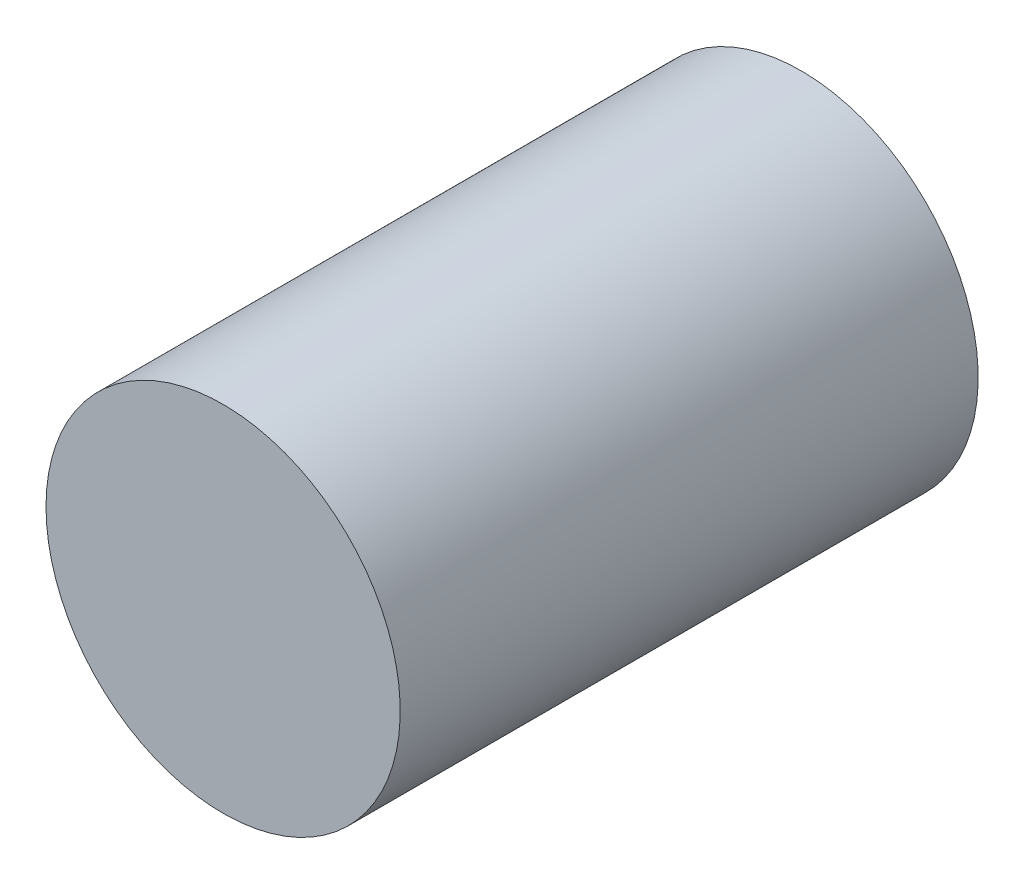
ISO-10303-21;
HEADER;
FILE_DESCRIPTION(('STEP AP214'),'2;1');
FILE_NAME('part.step','',(''),(''),'','','');
FILE_SCHEMA(('AUTOMOTIVE_DESIGN { 1 0 10303 214 1 1 1 1 }'));
ENDSEC;
DATA;
#1=APPLICATION_CONTEXT('core data for automotive mechanical design processes');
#2=APPLICATION_PROTOCOL_DEFINITION('international standard','automotive_design',2000,#1);
#3=PRODUCT_CONTEXT('',#1,'mechanical');
#4=PRODUCT('Part','Part','',(#3));
#5=PRODUCT_RELATED_PRODUCT_CATEGORY('part','',(#4));
#6=PRODUCT_DEFINITION_FORMATION('','',#4);
#7=PRODUCT_DEFINITION_CONTEXT('part definition',#1,'design');
#8=PRODUCT_DEFINITION('design','',#6,#7);
#9=PRODUCT_DEFINITION_SHAPE('','',#8);
#10=(LENGTH_UNIT() NAMED_UNIT(*) SI_UNIT(.MILLI.,.METRE.));
#11=(NAMED_UNIT(*) PLANE_ANGLE_UNIT() SI_UNIT($,.RADIAN.));
#12=(NAMED_UNIT(*) SI_UNIT($,.STERADIAN.) SOLID_ANGLE_UNIT());
#13=UNCERTAINTY_MEASURE_WITH_UNIT(LENGTH_MEASURE(1.E-05),#10,'distance_accuracy_value','');
#14=(GEOMETRIC_REPRESENTATION_CONTEXT(3) GLOBAL_UNCERTAINTY_ASSIGNED_CONTEXT((#13)) GLOBAL_UNIT_ASSIGNED_CONTEXT((#10,
#11,#12)) REPRESENTATION_CONTEXT('',''));
#15=CARTESIAN_POINT('',(0.,0.,0.));
#16=DIRECTION('',(0.,0.,1.));
#17=DIRECTION('',(1.,0.,0.));
#18=AXIS2_PLACEMENT_3D('',#15,#16,#17);
#19=CARTESIAN_POINT('',(0.,0.,186.));
#20=DIRECTION('',(0.,0.,-1.));
#21=DIRECTION('',(-1.,0.,0.));
#22=AXIS2_PLACEMENT_3D('',#19,#20,#21);
#23=CYLINDRICAL_SURFACE('',#22,57.);
#24=CARTESIAN_POINT('',(0.,0.,186.));
#25=DIRECTION('',(0.,0.,1.));
#26=DIRECTION('',(1.,0.,0.));
#27=AXIS2_PLACEMENT_3D('',#24,#25,#26);
#28=CIRCLE('',#27,57.);
#29=CARTESIAN_POINT('',(-57.,0.,186.));
#30=VERTEX_POINT('',#29);
#31=EDGE_CURVE('E50',#30,#30,#28,.T.);
#32=CARTESIAN_POINT('',(0.,0.,0.));
#33=DIRECTION('',(0.,0.,1.));
#34=DIRECTION('',(1.,0.,0.));
#35=AXIS2_PLACEMENT_3D('',#32,#33,#34);
#36=CIRCLE('',#35,57.);
#37=CARTESIAN_POINT('',(-57.,0.,0.));
#38=VERTEX_POINT('',#37);
#39=EDGE_CURVE('E55',#38,#38,#36,.T.);
#40=CARTESIAN_POINT('',(-57.,0.,186.));
#41=CARTESIAN_POINT('',(-57.,0.,184.0625));
#42=CARTESIAN_POINT('',(-57.,0.,182.125));
#43=CARTESIAN_POINT('',(-57.,0.,178.25));
#44=CARTESIAN_POINT('',(-57.,0.,176.3125));
#45=CARTESIAN_POINT('',(-57.,0.,172.4375));
#46=CARTESIAN_POINT('',(-57.,0.,170.5));
#47=CARTESIAN_POINT('',(-57.,0.,166.625));
#48=CARTESIAN_POINT('',(-57.,0.,164.6875));
#49=CARTESIAN_POINT('',(-57.,0.,160.8125));
#50=CARTESIAN_POINT('',(-57.,0.,158.875));
#51=CARTESIAN_POINT('',(-57.,0.,155.));
#52=CARTESIAN_POINT('',(-57.,0.,153.0625));
#53=CARTESIAN_POINT('',(-57.,0.,149.1875));
#54=CARTESIAN_POINT('',(-57.,0.,147.25));
#55=CARTESIAN_POINT('',(-57.,0.,143.375));
#56=CARTESIAN_POINT('',(-57.,0.,141.4375));
#57=CARTESIAN_POINT('',(-57.,0.,137.5625));
#58=CARTESIAN_POINT('',(-57.,0.,135.625));
#59=CARTESIAN_POINT('',(-57.,0.,131.75));
#60=CARTESIAN_POINT('',(-57.,0.,129.8125));
#61=CARTESIAN_POINT('',(-57.,0.,125.9375));
#62=CARTESIAN_POINT('',(-57.,0.,124.));
#63=CARTESIAN_POINT('',(-57.,0.,120.125));
#64=CARTESIAN_POINT('',(-57.,0.,118.1875));
#65=CARTESIAN_POINT('',(-57.,0.,114.3125));
#66=CARTESIAN_POINT('',(-57.,0.,112.375));
#67=CARTESIAN_POINT('',(-57.,0.,108.5));
#68=CARTESIAN_POINT('',(-57.,0.,106.5625));
#69=CARTESIAN_POINT('',(-57.,0.,102.6875));
#70=CARTESIAN_POINT('',(-57.,0.,100.75));
#71=CARTESIAN_POINT('',(-57.,0.,96.875));
#72=CARTESIAN_POINT('',(-57.,0.,94.9375));
#73=CARTESIAN_POINT('',(-57.,0.,91.0625));
#74=CARTESIAN_POINT('',(-57.,0.,89.125));
#75=CARTESIAN_POINT('',(-57.,0.,85.25));
#76=CARTESIAN_POINT('',(-57.,0.,83.3125));
#77=CARTESIAN_POINT('',(-57.,0.,79.4375));
#78=CARTESIAN_POINT('',(-57.,0.,77.5));
#79=CARTESIAN_POINT('',(-57.,0.,73.625));
#80=CARTESIAN_POINT('',(-57.,0.,71.6875));
#81=CARTESIAN_POINT('',(-57.,0.,67.8125));
#82=CARTESIAN_POINT('',(-57.,0.,65.875));
#83=CARTESIAN_POINT('',(-57.,0.,62.));
#84=CARTESIAN_POINT('',(-57.,0.,60.0625));
#85=CARTESIAN_POINT('',(-57.,0.,56.1875));
#86=CARTESIAN_POINT('',(-57.,0.,54.25));
#87=CARTESIAN_POINT('',(-57.,0.,50.375));
#88=CARTESIAN_POINT('',(-57.,0.,48.4375));
#89=CARTESIAN_POINT('',(-57.,0.,44.5625));
#90=CARTESIAN_POINT('',(-57.,0.,42.625));
#91=CARTESIAN_POINT('',(-57.,0.,38.75));
#92=CARTESIAN_POINT('',(-57.,0.,36.8125));
#93=CARTESIAN_POINT('',(-57.,0.,32.9375));
#94=CARTESIAN_POINT('',(-57.,0.,31.));
#95=CARTESIAN_POINT('',(-57.,0.,27.125));
#96=CARTESIAN_POINT('',(-57.,0.,25.1875));
#97=CARTESIAN_POINT('',(-57.,0.,21.3125));
#98=CARTESIAN_POINT('',(-57.,0.,19.375));
#99=CARTESIAN_POINT('',(-57.,0.,15.5));
#100=CARTESIAN_POINT('',(-57.,0.,13.5625));
#101=CARTESIAN_POINT('',(-57.,0.,9.68749999999997));
#102=CARTESIAN_POINT('',(-57.,0.,7.74999999999997));
#103=CARTESIAN_POINT('',(-57.,0.,3.87499999999997));
#104=CARTESIAN_POINT('',(-57.,0.,1.93749999999997));
#105=CARTESIAN_POINT('',(-57.,0.,0.));
#106=B_SPLINE_CURVE_WITH_KNOTS('',3,(#40,#41,#42,#43,#44,#45,#46,#47,#48,#49,#50,#51,#52,#53,
#54,#55,#56,#57,#58,#59,#60,#61,#62,#63,#64,#65,#66,#67,#68,#69,#70,#71,#72,#73,#74,#75,#76,#77,
#78,#79,#80,#81,#82,#83,#84,#85,#86,#87,#88,#89,#90,#91,#92,#93,#94,#95,#96,#97,#98,#99,#100,
#101,#102,#103,#104,#105),.UNSPECIFIED.,.F.,.F.,(4,2,2,2,2,2,2,2,2,2,2,2,2,2,2,2,2,2,2,2,2,2,2,
2,2,2,2,2,2,2,2,2,4),(0.,5.81250000000003,11.625,17.4375,23.25,29.0625,34.875,40.6875,46.5,
52.3125,58.125,63.9375,69.75,75.5625,81.375,87.1875,93.,98.8125,104.625,110.4375,116.25,
122.0625,127.875,133.6875,139.5,145.3125,151.125,156.9375,162.75,168.5625,174.375,180.1875,
186.),.UNSPECIFIED.);
#107=EDGE_CURVE('BSEAM42',#30,#38,#106,.T.);
#108=ORIENTED_EDGE('',*,*,#31,.F.);
#109=ORIENTED_EDGE('',*,*,#39,.T.);
#110=ORIENTED_EDGE('',*,*,#107,.T.);
#111=ORIENTED_EDGE('',*,*,#107,.F.);
#112=EDGE_LOOP('',(#108,#110,#109,#111));
#113=FACE_BOUND('',#112,.T.);
#114=ADVANCED_FACE('F42',(#113),#23,.T.);
#115=CARTESIAN_POINT('',(0.,0.,186.));
#116=DIRECTION('',(0.,0.,1.));
#117=DIRECTION('',(1.,0.,0.));
#118=AXIS2_PLACEMENT_3D('',#115,#116,#117);
#119=PLANE('',#118);
#120=ORIENTED_EDGE('',*,*,#31,.T.);
#121=EDGE_LOOP('',(#120));
#122=FACE_BOUND('',#121,.T.);
#123=ADVANCED_FACE('F73',(#122),#119,.T.);
#124=CARTESIAN_POINT('',(0.,0.,0.));
#125=DIRECTION('',(0.,0.,1.));
#126=DIRECTION('',(1.,0.,0.));
#127=AXIS2_PLACEMENT_3D('',#124,#125,#126);
#128=PLANE('',#127);
#129=CARTESIAN_POINT('',(0.,0.,0.));
#130=DIRECTION('',(0.,0.,-1.));
#131=DIRECTION('',(-1.,0.,0.));
#132=AXIS2_PLACEMENT_3D('',#129,#130,#131);
#133=CIRCLE('',#132,31.8306186798994);
#134=CARTESIAN_POINT('',(-31.8306186798994,0.,0.));
#135=VERTEX_POINT('',#134);
#136=EDGE_CURVE('E61',#135,#135,#133,.T.);
#137=ORIENTED_EDGE('',*,*,#136,.F.);
#138=EDGE_LOOP('',(#137));
#139=FACE_BOUND('',#138,.T.);
#140=ORIENTED_EDGE('',*,*,#39,.F.);
#141=EDGE_LOOP('',(#140));
#142=FACE_BOUND('',#141,.T.);
#143=ADVANCED_FACE('F69',(#139,#142),#128,.F.);
#144=CARTESIAN_POINT('',(0.,0.,10.));
#145=DIRECTION('',(0.,0.,-1.));
#146=DIRECTION('',(-1.,0.,0.));
#147=AXIS2_PLACEMENT_3D('',#144,#145,#146);
#148=PLANE('',#147);
#149=CARTESIAN_POINT('',(0.,0.,10.));
#150=DIRECTION('',(0.,0.,-1.));
#151=DIRECTION('',(-1.,0.,0.));
#152=AXIS2_PLACEMENT_3D('',#149,#150,#151);
#153=CIRCLE('',#152,21.8306186798994);
#154=CARTESIAN_POINT('',(-21.8306186798994,0.,10.));
#155=VERTEX_POINT('',#154);
#156=EDGE_CURVE('E10',#155,#155,#153,.T.);
#157=ORIENTED_EDGE('',*,*,#156,.T.);
#158=EDGE_LOOP('',(#157));
#159=FACE_BOUND('',#158,.T.);
#160=ADVANCED_FACE('F72',(#159),#148,.T.);
#161=CARTESIAN_POINT('',(0.,0.,0.));
#162=DIRECTION('',(0.,0.,-1.));
#163=DIRECTION('',(-1.,0.,0.));
#164=AXIS2_PLACEMENT_3D('',#161,#162,#163);
#165=TOROIDAL_SURFACE('',#164,21.8306186798994,10.);
#166=ORIENTED_EDGE('',*,*,#136,.T.);
#167=EDGE_LOOP('',(#166));
#168=FACE_BOUND('',#167,.T.);
#169=ORIENTED_EDGE('',*,*,#156,.F.);
#170=EDGE_LOOP('',(#169));
#171=FACE_BOUND('',#170,.T.);
#172=ADVANCED_FACE('F44',(#168,#171),#165,.F.);
#173=CLOSED_SHELL('',(#114,#123,#143,#160,#172));
#174=MANIFOLD_SOLID_BREP('B2',#173);
#175=ADVANCED_BREP_SHAPE_REPRESENTATION('',(#18,#174),#14);
#176=SHAPE_DEFINITION_REPRESENTATION(#9,#175);
ENDSEC;
END-ISO-10303-21;
